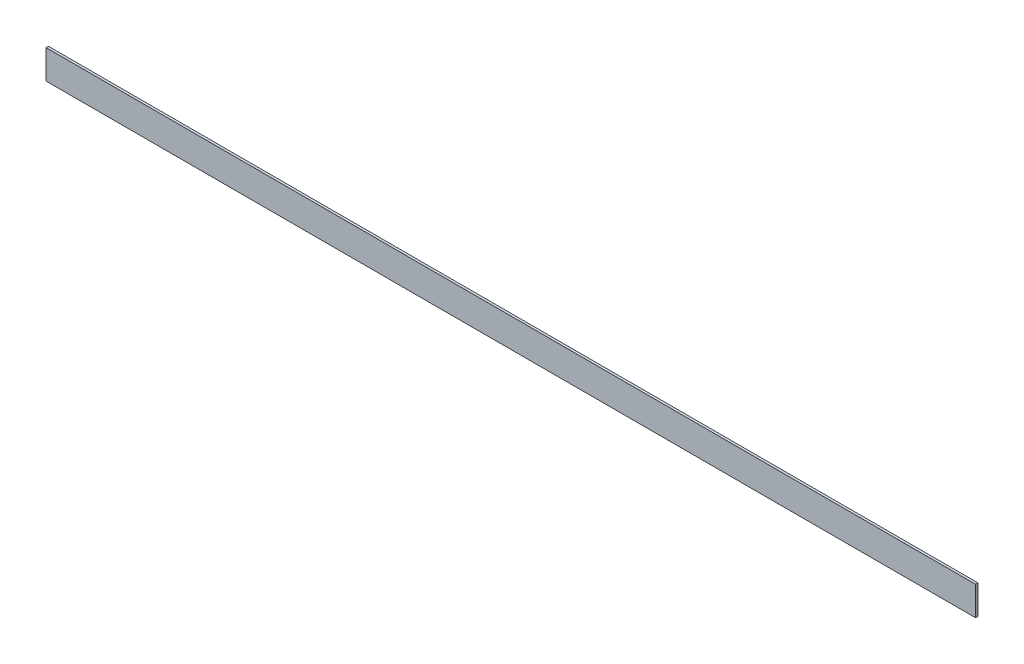
ISO-10303-21;
HEADER;
FILE_DESCRIPTION(('STEP AP214'),'2;1');
FILE_NAME('part.step','',(''),(''),'','','');
FILE_SCHEMA(('AUTOMOTIVE_DESIGN { 1 0 10303 214 1 1 1 1 }'));
ENDSEC;
DATA;
#1=APPLICATION_CONTEXT('core data for automotive mechanical design processes');
#2=APPLICATION_PROTOCOL_DEFINITION('international standard','automotive_design',2000,#1);
#3=PRODUCT_CONTEXT('',#1,'mechanical');
#4=PRODUCT('Part','Part','',(#3));
#5=PRODUCT_RELATED_PRODUCT_CATEGORY('part','',(#4));
#6=PRODUCT_DEFINITION_FORMATION('','',#4);
#7=PRODUCT_DEFINITION_CONTEXT('part definition',#1,'design');
#8=PRODUCT_DEFINITION('design','',#6,#7);
#9=PRODUCT_DEFINITION_SHAPE('','',#8);
#10=(LENGTH_UNIT() NAMED_UNIT(*) SI_UNIT(.MILLI.,.METRE.));
#11=(NAMED_UNIT(*) PLANE_ANGLE_UNIT() SI_UNIT($,.RADIAN.));
#12=(NAMED_UNIT(*) SI_UNIT($,.STERADIAN.) SOLID_ANGLE_UNIT());
#13=UNCERTAINTY_MEASURE_WITH_UNIT(LENGTH_MEASURE(1.E-05),#10,'distance_accuracy_value','');
#14=(GEOMETRIC_REPRESENTATION_CONTEXT(3) GLOBAL_UNCERTAINTY_ASSIGNED_CONTEXT((#13)) GLOBAL_UNIT_ASSIGNED_CONTEXT((#10,
#11,#12)) REPRESENTATION_CONTEXT('',''));
#15=CARTESIAN_POINT('',(0.,0.,0.));
#16=DIRECTION('',(0.,0.,1.));
#17=DIRECTION('',(1.,0.,0.));
#18=AXIS2_PLACEMENT_3D('',#15,#16,#17);
#19=CARTESIAN_POINT('',(4889.5,-0.01,-0.01));
#20=DIRECTION('',(1.,0.,0.));
#21=DIRECTION('',(0.,1.,0.));
#22=AXIS2_PLACEMENT_3D('',#19,#20,#21);
#23=PLANE('',#22);
#24=DIRECTION('',(0.,1.,0.));
#25=VECTOR('',#24,1.);
#26=CARTESIAN_POINT('',(4889.5,76.2000000000003,12.7));
#27=LINE('',#26,#25);
#28=CARTESIAN_POINT('',(4889.5,0.,12.7));
#29=VERTEX_POINT('',#28);
#30=CARTESIAN_POINT('',(4889.5,152.400000000001,12.7));
#31=VERTEX_POINT('',#30);
#32=EDGE_CURVE('E69',#29,#31,#27,.T.);
#33=ORIENTED_EDGE('',*,*,#32,.F.);
#34=DIRECTION('',(0.,0.,1.));
#35=VECTOR('',#34,1.);
#36=CARTESIAN_POINT('',(4889.5,0.,6.35));
#37=LINE('',#36,#35);
#38=CARTESIAN_POINT('',(4889.5,0.,0.));
#39=VERTEX_POINT('',#38);
#40=EDGE_CURVE('E56',#39,#29,#37,.T.);
#41=ORIENTED_EDGE('',*,*,#40,.F.);
#42=DIRECTION('',(0.,-1.,0.));
#43=VECTOR('',#42,1.);
#44=CARTESIAN_POINT('',(4889.5,76.2000000000003,0.));
#45=LINE('',#44,#43);
#46=CARTESIAN_POINT('',(4889.5,152.4,0.));
#47=VERTEX_POINT('',#46);
#48=EDGE_CURVE('E21',#47,#39,#45,.T.);
#49=ORIENTED_EDGE('',*,*,#48,.F.);
#50=DIRECTION('',(0.,0.,-1.));
#51=VECTOR('',#50,1.);
#52=CARTESIAN_POINT('',(4889.5,152.400000000001,6.35));
#53=LINE('',#52,#51);
#54=EDGE_CURVE('E82',#31,#47,#53,.T.);
#55=ORIENTED_EDGE('',*,*,#54,.F.);
#56=EDGE_LOOP('',(#33,#41,#49,#55));
#57=FACE_BOUND('',#56,.T.);
#58=ADVANCED_FACE('F17',(#57),#23,.T.);
#59=CARTESIAN_POINT('',(4889.50999999999,-0.0100000000000033,0.));
#60=DIRECTION('',(0.,0.,-1.));
#61=DIRECTION('',(-1.,0.,0.));
#62=AXIS2_PLACEMENT_3D('',#59,#60,#61);
#63=PLANE('',#62);
#64=DIRECTION('',(-1.,0.,0.));
#65=VECTOR('',#64,1.);
#66=CARTESIAN_POINT('',(2444.74999999999,152.4,0.));
#67=LINE('',#66,#65);
#68=CARTESIAN_POINT('',(1.94013473556305E-13,152.4,0.));
#69=VERTEX_POINT('',#68);
#70=EDGE_CURVE('E65',#47,#69,#67,.T.);
#71=ORIENTED_EDGE('',*,*,#70,.F.);
#72=ORIENTED_EDGE('',*,*,#48,.T.);
#73=DIRECTION('',(1.,0.,0.));
#74=VECTOR('',#73,1.);
#75=CARTESIAN_POINT('',(2444.74999999999,0.,0.));
#76=LINE('',#75,#74);
#77=CARTESIAN_POINT('',(0.,0.,0.));
#78=VERTEX_POINT('',#77);
#79=EDGE_CURVE('E62',#78,#39,#76,.T.);
#80=ORIENTED_EDGE('',*,*,#79,.F.);
#81=DIRECTION('',(0.,-1.,0.));
#82=VECTOR('',#81,1.);
#83=CARTESIAN_POINT('',(0.,76.2,0.));
#84=LINE('',#83,#82);
#85=EDGE_CURVE('E84',#69,#78,#84,.T.);
#86=ORIENTED_EDGE('',*,*,#85,.F.);
#87=EDGE_LOOP('',(#71,#72,#80,#86));
#88=FACE_BOUND('',#87,.T.);
#89=ADVANCED_FACE('F61',(#88),#63,.T.);
#90=CARTESIAN_POINT('',(-0.01,0.,-0.01));
#91=DIRECTION('',(0.,-1.,0.));
#92=DIRECTION('',(1.,0.,0.));
#93=AXIS2_PLACEMENT_3D('',#90,#91,#92);
#94=PLANE('',#93);
#95=DIRECTION('',(1.,0.,0.));
#96=VECTOR('',#95,1.);
#97=CARTESIAN_POINT('',(2444.74999999999,0.,12.7));
#98=LINE('',#97,#96);
#99=CARTESIAN_POINT('',(0.,0.,12.7));
#100=VERTEX_POINT('',#99);
#101=EDGE_CURVE('E71',#100,#29,#98,.T.);
#102=ORIENTED_EDGE('',*,*,#101,.F.);
#103=DIRECTION('',(0.,0.,1.));
#104=VECTOR('',#103,1.);
#105=CARTESIAN_POINT('',(0.,0.,6.35));
#106=LINE('',#105,#104);
#107=EDGE_CURVE('E75',#78,#100,#106,.T.);
#108=ORIENTED_EDGE('',*,*,#107,.F.);
#109=ORIENTED_EDGE('',*,*,#79,.T.);
#110=ORIENTED_EDGE('',*,*,#40,.T.);
#111=EDGE_LOOP('',(#102,#108,#109,#110));
#112=FACE_BOUND('',#111,.T.);
#113=ADVANCED_FACE('F73',(#112),#94,.T.);
#114=CARTESIAN_POINT('',(-0.0100000000000478,-0.0100000000000033,12.7));
#115=DIRECTION('',(0.,0.,1.));
#116=DIRECTION('',(1.,0.,0.));
#117=AXIS2_PLACEMENT_3D('',#114,#115,#116);
#118=PLANE('',#117);
#119=DIRECTION('',(1.,0.,0.));
#120=VECTOR('',#119,1.);
#121=CARTESIAN_POINT('',(2444.74999999999,152.4,12.7));
#122=LINE('',#121,#120);
#123=CARTESIAN_POINT('',(2.28601216924487E-13,152.4,12.7));
#124=VERTEX_POINT('',#123);
#125=EDGE_CURVE('E36',#124,#31,#122,.T.);
#126=ORIENTED_EDGE('',*,*,#125,.F.);
#127=DIRECTION('',(0.,1.,0.));
#128=VECTOR('',#127,1.);
#129=CARTESIAN_POINT('',(0.,76.2,12.7));
#130=LINE('',#129,#128);
#131=EDGE_CURVE('E27',#100,#124,#130,.T.);
#132=ORIENTED_EDGE('',*,*,#131,.F.);
#133=ORIENTED_EDGE('',*,*,#101,.T.);
#134=ORIENTED_EDGE('',*,*,#32,.T.);
#135=EDGE_LOOP('',(#126,#132,#133,#134));
#136=FACE_BOUND('',#135,.T.);
#137=ADVANCED_FACE('F89',(#136),#118,.T.);
#138=CARTESIAN_POINT('',(4889.50999999999,152.400000000001,-0.01));
#139=DIRECTION('',(0.,1.,0.));
#140=DIRECTION('',(-1.,0.,0.));
#141=AXIS2_PLACEMENT_3D('',#138,#139,#140);
#142=PLANE('',#141);
#143=ORIENTED_EDGE('',*,*,#125,.T.);
#144=ORIENTED_EDGE('',*,*,#54,.T.);
#145=ORIENTED_EDGE('',*,*,#70,.T.);
#146=DIRECTION('',(0.,0.,-1.));
#147=VECTOR('',#146,1.);
#148=CARTESIAN_POINT('',(0.,152.4,6.35));
#149=LINE('',#148,#147);
#150=EDGE_CURVE('E11',#124,#69,#149,.T.);
#151=ORIENTED_EDGE('',*,*,#150,.F.);
#152=EDGE_LOOP('',(#143,#144,#145,#151));
#153=FACE_BOUND('',#152,.T.);
#154=ADVANCED_FACE('F91',(#153),#142,.T.);
#155=CARTESIAN_POINT('',(0.,152.41,-0.01));
#156=DIRECTION('',(-1.,0.,0.));
#157=DIRECTION('',(0.,-1.,0.));
#158=AXIS2_PLACEMENT_3D('',#155,#156,#157);
#159=PLANE('',#158);
#160=ORIENTED_EDGE('',*,*,#131,.T.);
#161=ORIENTED_EDGE('',*,*,#150,.T.);
#162=ORIENTED_EDGE('',*,*,#85,.T.);
#163=ORIENTED_EDGE('',*,*,#107,.T.);
#164=EDGE_LOOP('',(#160,#161,#162,#163));
#165=FACE_BOUND('',#164,.T.);
#166=ADVANCED_FACE('F19',(#165),#159,.T.);
#167=CLOSED_SHELL('',(#58,#89,#113,#137,#154,#166));
#168=MANIFOLD_SOLID_BREP('B1',#167);
#169=ADVANCED_BREP_SHAPE_REPRESENTATION('',(#18,#168),#14);
#170=SHAPE_DEFINITION_REPRESENTATION(#9,#169);
ENDSEC;
END-ISO-10303-21;
